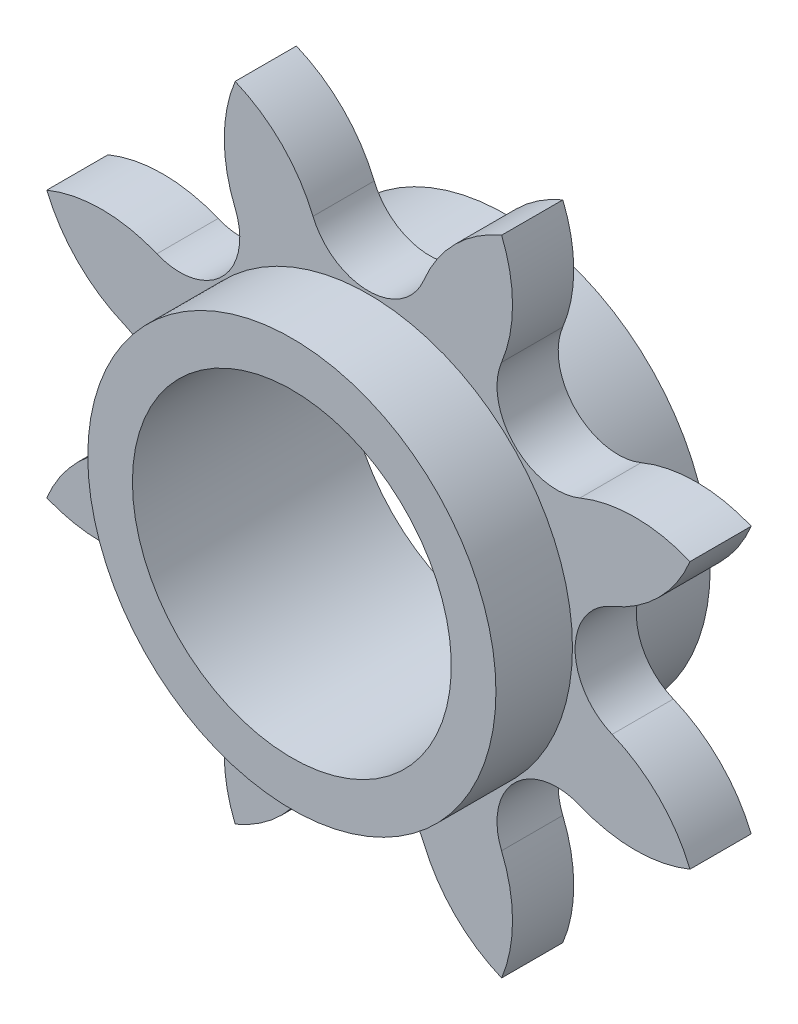
ISO-10303-21;
HEADER;
FILE_DESCRIPTION(('STEP AP214'),'2;1');
FILE_NAME('part.step','',(''),(''),'','','');
FILE_SCHEMA(('AUTOMOTIVE_DESIGN { 1 0 10303 214 1 1 1 1 }'));
ENDSEC;
DATA;
#1=APPLICATION_CONTEXT('core data for automotive mechanical design processes');
#2=APPLICATION_PROTOCOL_DEFINITION('international standard','automotive_design',2000,#1);
#3=PRODUCT_CONTEXT('',#1,'mechanical');
#4=PRODUCT('Part','Part','',(#3));
#5=PRODUCT_RELATED_PRODUCT_CATEGORY('part','',(#4));
#6=PRODUCT_DEFINITION_FORMATION('','',#4);
#7=PRODUCT_DEFINITION_CONTEXT('part definition',#1,'design');
#8=PRODUCT_DEFINITION('design','',#6,#7);
#9=PRODUCT_DEFINITION_SHAPE('','',#8);
#10=(LENGTH_UNIT() NAMED_UNIT(*) SI_UNIT(.MILLI.,.METRE.));
#11=(NAMED_UNIT(*) PLANE_ANGLE_UNIT() SI_UNIT($,.RADIAN.));
#12=(NAMED_UNIT(*) SI_UNIT($,.STERADIAN.) SOLID_ANGLE_UNIT());
#13=UNCERTAINTY_MEASURE_WITH_UNIT(LENGTH_MEASURE(1.E-05),#10,'distance_accuracy_value','');
#14=(GEOMETRIC_REPRESENTATION_CONTEXT(3) GLOBAL_UNCERTAINTY_ASSIGNED_CONTEXT((#13)) GLOBAL_UNIT_ASSIGNED_CONTEXT((#10,
#11,#12)) REPRESENTATION_CONTEXT('',''));
#15=CARTESIAN_POINT('',(0.,0.,0.));
#16=DIRECTION('',(0.,0.,1.));
#17=DIRECTION('',(1.,0.,0.));
#18=AXIS2_PLACEMENT_3D('',#15,#16,#17);
#19=CARTESIAN_POINT('',(8.9217637900216,3.69549432159127,2.4));
#20=DIRECTION('',(0.,0.,1.));
#21=DIRECTION('',(1.,0.,0.));
#22=AXIS2_PLACEMENT_3D('',#19,#20,#21);
#23=PLANE('',#22);
#24=CARTESIAN_POINT('',(0.,0.,2.399999772));
#25=DIRECTION('',(0.,0.,-1.));
#26=DIRECTION('',(-1.,0.,0.));
#27=AXIS2_PLACEMENT_3D('',#24,#25,#26);
#28=CIRCLE('',#27,8.);
#29=CARTESIAN_POINT('',(-8.,0.,2.399999772));
#30=VERTEX_POINT('',#29);
#31=EDGE_CURVE('E749',#30,#30,#28,.T.);
#32=ORIENTED_EDGE('',*,*,#31,.T.);
#33=EDGE_LOOP('',(#32));
#34=FACE_BOUND('',#33,.T.);
#35=CARTESIAN_POINT('',(7.39100003374093,7.39100003364535,2.4));
#36=DIRECTION('',(0.,0.,-1.));
#37=DIRECTION('',(1.,0.,0.));
#38=AXIS2_PLACEMENT_3D('',#35,#36,#37);
#39=CIRCLE('',#38,2.35);
#40=CARTESIAN_POINT('',(8.29030689764834,5.21988346272406,2.4));
#41=VERTEX_POINT('',#40);
#42=CARTESIAN_POINT('',(5.21988346281964,8.29030689755275,2.4));
#43=VERTEX_POINT('',#42);
#44=EDGE_CURVE('E279',#41,#43,#39,.T.);
#45=ORIENTED_EDGE('',*,*,#44,.T.);
#46=CARTESIAN_POINT('',(-3.62645267870014E-05,10.452467400397,2.4));
#47=DIRECTION('',(0.,0.,1.));
#48=DIRECTION('',(1.,0.,0.));
#49=AXIS2_PLACEMENT_3D('',#46,#47,#48);
#50=CIRCLE('',#49,5.65);
#51=CARTESIAN_POINT('',(5.22250382219537,12.6082909188187,2.4));
#52=VERTEX_POINT('',#51);
#53=EDGE_CURVE('E148',#43,#52,#50,.T.);
#54=ORIENTED_EDGE('',*,*,#53,.T.);
#55=CARTESIAN_POINT('',(7.39102751664642,7.39101145662725,2.4));
#56=DIRECTION('',(0.,0.,1.));
#57=DIRECTION('',(1.,0.,0.));
#58=AXIS2_PLACEMENT_3D('',#55,#56,#57);
#59=CIRCLE('',#58,5.65);
#60=CARTESIAN_POINT('',(2.17111657085857,9.55319315991775,2.4));
#61=VERTEX_POINT('',#60);
#62=EDGE_CURVE('E359',#52,#61,#59,.T.);
#63=ORIENTED_EDGE('',*,*,#62,.T.);
#64=CARTESIAN_POINT('',(1.14023537898278E-05,10.4525275175544,2.4));
#65=DIRECTION('',(0.,0.,-1.));
#66=DIRECTION('',(1.,0.,0.));
#67=AXIS2_PLACEMENT_3D('',#64,#65,#66);
#68=CIRCLE('',#67,2.34999998713487);
#69=CARTESIAN_POINT('',(-2.17109709755032,9.55320120237283,2.4));
#70=VERTEX_POINT('',#69);
#71=EDGE_CURVE('E356',#61,#70,#68,.T.);
#72=ORIENTED_EDGE('',*,*,#71,.T.);
#73=CARTESIAN_POINT('',(-7.39100525950942,7.39101277841141,2.4));
#74=DIRECTION('',(0.,0.,1.));
#75=DIRECTION('',(1.,0.,0.));
#76=AXIS2_PLACEMENT_3D('',#73,#74,#75);
#77=CIRCLE('',#76,5.65);
#78=CARTESIAN_POINT('',(-5.22254251672652,12.6083175742962,2.4));
#79=VERTEX_POINT('',#78);
#80=EDGE_CURVE('E358',#70,#79,#77,.T.);
#81=ORIENTED_EDGE('',*,*,#80,.T.);
#82=CARTESIAN_POINT('',(1.14023537898278E-05,10.4525275175544,2.4));
#83=DIRECTION('',(0.,0.,1.));
#84=DIRECTION('',(1.,0.,0.));
#85=AXIS2_PLACEMENT_3D('',#82,#83,#84);
#86=CIRCLE('',#85,5.65000001826973);
#87=CARTESIAN_POINT('',(-5.2198834340444,8.29030687585487,2.4));
#88=VERTEX_POINT('',#87);
#89=EDGE_CURVE('E361',#79,#88,#86,.T.);
#90=ORIENTED_EDGE('',*,*,#89,.T.);
#91=CARTESIAN_POINT('',(-7.39101138319707,7.39102751574179,2.4));
#92=DIRECTION('',(0.,0.,-1.));
#93=DIRECTION('',(1.,0.,0.));
#94=AXIS2_PLACEMENT_3D('',#91,#92,#93);
#95=CIRCLE('',#94,2.34999998704623);
#96=CARTESIAN_POINT('',(-8.2902987856972,5.21990289775648,2.4));
#97=VERTEX_POINT('',#96);
#98=EDGE_CURVE('E367',#88,#97,#95,.T.);
#99=ORIENTED_EDGE('',*,*,#98,.T.);
#100=CARTESIAN_POINT('',(-10.4524397965896,-2.49033742264967E-05,2.4));
#101=DIRECTION('',(0.,0.,1.));
#102=DIRECTION('',(1.,0.,0.));
#103=AXIS2_PLACEMENT_3D('',#100,#101,#102);
#104=CIRCLE('',#103,5.65);
#105=CARTESIAN_POINT('',(-12.6082908612753,5.22250381238154,2.4));
#106=VERTEX_POINT('',#105);
#107=EDGE_CURVE('E369',#97,#106,#104,.T.);
#108=ORIENTED_EDGE('',*,*,#107,.T.);
#109=CARTESIAN_POINT('',(-7.39101138319707,7.39102751574179,2.4));
#110=DIRECTION('',(0.,0.,1.));
#111=DIRECTION('',(1.,0.,0.));
#112=AXIS2_PLACEMENT_3D('',#109,#110,#111);
#113=CIRCLE('',#112,5.65000001808949);
#114=CARTESIAN_POINT('',(-9.55319313609252,2.17111657092126,2.4));
#115=VERTEX_POINT('',#114);
#116=EDGE_CURVE('E371',#106,#115,#113,.T.);
#117=ORIENTED_EDGE('',*,*,#116,.T.);
#118=CARTESIAN_POINT('',(-10.4525274986527,1.13905307449056E-05,2.4));
#119=DIRECTION('',(0.,0.,-1.));
#120=DIRECTION('',(1.,0.,0.));
#121=AXIS2_PLACEMENT_3D('',#118,#119,#120);
#122=CIRCLE('',#121,2.35);
#123=CARTESIAN_POINT('',(-9.55320119040504,-2.17109712617073,2.4));
#124=VERTEX_POINT('',#123);
#125=EDGE_CURVE('E373',#115,#124,#122,.T.);
#126=ORIENTED_EDGE('',*,*,#125,.T.);
#127=CARTESIAN_POINT('',(-7.39101276650105,-7.39100528815362,2.4));
#128=DIRECTION('',(0.,0.,1.));
#129=DIRECTION('',(1.,0.,0.));
#130=AXIS2_PLACEMENT_3D('',#127,#128,#129);
#131=CIRCLE('',#130,5.65);
#132=CARTESIAN_POINT('',(-12.6083175553945,-5.22254252854956,2.4));
#133=VERTEX_POINT('',#132);
#134=EDGE_CURVE('E375',#124,#133,#131,.T.);
#135=ORIENTED_EDGE('',*,*,#134,.T.);
#136=CARTESIAN_POINT('',(-10.4525274986527,1.13905307449056E-05,2.4));
#137=DIRECTION('',(0.,0.,1.));
#138=DIRECTION('',(1.,0.,0.));
#139=AXIS2_PLACEMENT_3D('',#136,#137,#138);
#140=CIRCLE('',#139,5.65000001826973);
#141=CARTESIAN_POINT('',(-8.29030685695307,-5.21988344586741,2.4));
#142=VERTEX_POINT('',#141);
#143=EDGE_CURVE('E377',#133,#142,#140,.T.);
#144=ORIENTED_EDGE('',*,*,#143,.T.);
#145=CARTESIAN_POINT('',(-7.39102749188302,-7.39101140698789,2.4));
#146=DIRECTION('',(0.,0.,-1.));
#147=DIRECTION('',(1.,0.,0.));
#148=AXIS2_PLACEMENT_3D('',#145,#146,#147);
#149=CIRCLE('',#148,2.35);
#150=CARTESIAN_POINT('',(-5.21990286687494,-8.29029882638367,2.4));
#151=VERTEX_POINT('',#150);
#152=EDGE_CURVE('E379',#142,#151,#149,.T.);
#153=ORIENTED_EDGE('',*,*,#152,.T.);
#154=CARTESIAN_POINT('',(2.49342315909035E-05,-10.4524398373344,2.4));
#155=DIRECTION('',(0.,0.,1.));
#156=DIRECTION('',(1.,0.,0.));
#157=AXIS2_PLACEMENT_3D('',#154,#155,#156);
#158=CIRCLE('',#157,5.65);
#159=CARTESIAN_POINT('',(-5.22250378852277,-12.6082908850661,2.4));
#160=VERTEX_POINT('',#159);
#161=EDGE_CURVE('E381',#151,#160,#158,.T.);
#162=ORIENTED_EDGE('',*,*,#161,.T.);
#163=CARTESIAN_POINT('',(-7.39102749188302,-7.39101140698789,2.4));
#164=DIRECTION('',(0.,0.,1.));
#165=DIRECTION('',(1.,0.,0.));
#166=AXIS2_PLACEMENT_3D('',#163,#164,#165);
#167=CIRCLE('',#166,5.65000001808949);
#168=CARTESIAN_POINT('',(-2.17111654706252,-9.55319315988343,2.4));
#169=VERTEX_POINT('',#168);
#170=EDGE_CURVE('E383',#160,#169,#167,.T.);
#171=ORIENTED_EDGE('',*,*,#170,.T.);
#172=CARTESIAN_POINT('',(-1.13666719742071E-05,-10.4525275224435,2.4));
#173=DIRECTION('',(0.,0.,-1.));
#174=DIRECTION('',(1.,0.,0.));
#175=AXIS2_PLACEMENT_3D('',#172,#173,#174);
#176=CIRCLE('',#175,2.35);
#177=CARTESIAN_POINT('',(2.1710971500295,-9.55320121419586,2.4));
#178=VERTEX_POINT('',#177);
#179=EDGE_CURVE('E385',#169,#178,#176,.T.);
#180=ORIENTED_EDGE('',*,*,#179,.T.);
#181=CARTESIAN_POINT('',(7.39100531201239,-7.39101279029188,2.4));
#182=DIRECTION('',(0.,0.,1.));
#183=DIRECTION('',(1.,0.,0.));
#184=AXIS2_PLACEMENT_3D('',#181,#182,#183);
#185=CIRCLE('',#184,5.65);
#186=CARTESIAN_POINT('',(5.22254255240833,-12.6083175791853,2.4));
#187=VERTEX_POINT('',#186);
#188=EDGE_CURVE('E387',#178,#187,#185,.T.);
#189=ORIENTED_EDGE('',*,*,#188,.T.);
#190=CARTESIAN_POINT('',(-1.13666719742071E-05,-10.4525275224435,2.4));
#191=DIRECTION('',(0.,0.,1.));
#192=DIRECTION('',(1.,0.,0.));
#193=AXIS2_PLACEMENT_3D('',#190,#191,#192);
#194=CIRCLE('',#193,5.65000001826973);
#195=CARTESIAN_POINT('',(5.21988346972618,-8.29030688074389,2.4));
#196=VERTEX_POINT('',#195);
#197=EDGE_CURVE('E389',#187,#196,#194,.T.);
#198=ORIENTED_EDGE('',*,*,#197,.T.);
#199=CARTESIAN_POINT('',(7.39101143084667,-7.39102751567385,2.4));
#200=DIRECTION('',(0.,0.,-1.));
#201=DIRECTION('',(1.,0.,0.));
#202=AXIS2_PLACEMENT_3D('',#199,#200,#201);
#203=CIRCLE('',#202,2.35);
#204=CARTESIAN_POINT('',(8.29029885024244,-5.21990289066577,2.4));
#205=VERTEX_POINT('',#204);
#206=EDGE_CURVE('E391',#196,#205,#203,.T.);
#207=ORIENTED_EDGE('',*,*,#206,.T.);
#208=CARTESIAN_POINT('',(10.4524398611928,2.4910440924418E-05,2.4));
#209=DIRECTION('',(0.,0.,1.));
#210=DIRECTION('',(1.,0.,0.));
#211=AXIS2_PLACEMENT_3D('',#208,#209,#210);
#212=CIRCLE('',#211,5.65);
#213=CARTESIAN_POINT('',(12.6082909089248,-5.22250381231332,2.4));
#214=VERTEX_POINT('',#213);
#215=EDGE_CURVE('E393',#205,#214,#212,.T.);
#216=ORIENTED_EDGE('',*,*,#215,.T.);
#217=CARTESIAN_POINT('',(7.39101143084667,-7.39102751567385,2.4));
#218=DIRECTION('',(0.,0.,1.));
#219=DIRECTION('',(1.,0.,0.));
#220=AXIS2_PLACEMENT_3D('',#217,#218,#219);
#221=CIRCLE('',#220,5.65000001808949);
#222=CARTESIAN_POINT('',(9.5531931837422,-2.17111657085335,2.4));
#223=VERTEX_POINT('',#222);
#224=EDGE_CURVE('E214',#214,#223,#221,.T.);
#225=ORIENTED_EDGE('',*,*,#224,.T.);
#226=CARTESIAN_POINT('',(10.4525275463023,-1.1390462801873E-05,2.4));
#227=DIRECTION('',(0.,0.,-1.));
#228=DIRECTION('',(1.,0.,0.));
#229=AXIS2_PLACEMENT_3D('',#226,#227,#228);
#230=CIRCLE('',#229,2.35);
#231=CARTESIAN_POINT('',(9.55320123805464,2.17109712623868,2.4));
#232=VERTEX_POINT('',#231);
#233=EDGE_CURVE('E209',#223,#232,#230,.T.);
#234=ORIENTED_EDGE('',*,*,#233,.T.);
#235=CARTESIAN_POINT('',(7.39101281409294,7.39100528819766,2.4));
#236=DIRECTION('',(0.,0.,1.));
#237=DIRECTION('',(1.,0.,0.));
#238=AXIS2_PLACEMENT_3D('',#235,#236,#237);
#239=CIRCLE('',#238,5.65);
#240=CARTESIAN_POINT('',(12.6083176099777,5.22254254541476,2.4));
#241=VERTEX_POINT('',#240);
#242=EDGE_CURVE('E212',#232,#241,#239,.T.);
#243=ORIENTED_EDGE('',*,*,#242,.T.);
#244=CARTESIAN_POINT('',(10.4525275463023,-1.1390462801873E-05,2.4));
#245=DIRECTION('',(0.,0.,1.));
#246=DIRECTION('',(1.,0.,0.));
#247=AXIS2_PLACEMENT_3D('',#244,#245,#246);
#248=CIRCLE('',#247,5.65000003644178);
#249=EDGE_CURVE('E56',#241,#41,#248,.T.);
#250=ORIENTED_EDGE('',*,*,#249,.T.);
#251=EDGE_LOOP('',(#45,#54,#63,#72,#81,#90,#99,#108,#117,#126,#135,#144,#153,#162,#171,#180,
#189,#198,#207,#216,#225,#234,#243,#250));
#252=FACE_BOUND('',#251,.T.);
#253=ADVANCED_FACE('F38',(#34,#252),#23,.T.);
#254=CARTESIAN_POINT('',(8.9217637900216,3.69549432159127,0.));
#255=DIRECTION('',(0.,0.,1.));
#256=DIRECTION('',(1.,0.,0.));
#257=AXIS2_PLACEMENT_3D('',#254,#255,#256);
#258=PLANE('',#257);
#259=CARTESIAN_POINT('',(0.,0.,0.));
#260=DIRECTION('',(0.,0.,-1.));
#261=DIRECTION('',(-1.,0.,0.));
#262=AXIS2_PLACEMENT_3D('',#259,#260,#261);
#263=CIRCLE('',#262,8.);
#264=CARTESIAN_POINT('',(-8.,0.,0.));
#265=VERTEX_POINT('',#264);
#266=EDGE_CURVE('E11',#265,#265,#263,.T.);
#267=ORIENTED_EDGE('',*,*,#266,.F.);
#268=EDGE_LOOP('',(#267));
#269=FACE_BOUND('',#268,.T.);
#270=CARTESIAN_POINT('',(7.39100003374093,7.39100003364535,0.));
#271=DIRECTION('',(0.,0.,-1.));
#272=DIRECTION('',(1.,0.,0.));
#273=AXIS2_PLACEMENT_3D('',#270,#271,#272);
#274=CIRCLE('',#273,2.35);
#275=CARTESIAN_POINT('',(8.29030689764834,5.21988346272406,0.));
#276=VERTEX_POINT('',#275);
#277=CARTESIAN_POINT('',(5.21988346281964,8.29030689755275,0.));
#278=VERTEX_POINT('',#277);
#279=EDGE_CURVE('E232',#276,#278,#274,.T.);
#280=ORIENTED_EDGE('',*,*,#279,.F.);
#281=CARTESIAN_POINT('',(10.4525275463023,-1.1390462801873E-05,0.));
#282=DIRECTION('',(0.,0.,1.));
#283=DIRECTION('',(1.,0.,0.));
#284=AXIS2_PLACEMENT_3D('',#281,#282,#283);
#285=CIRCLE('',#284,5.65000003644178);
#286=CARTESIAN_POINT('',(12.6083176099777,5.22254254541476,0.));
#287=VERTEX_POINT('',#286);
#288=EDGE_CURVE('E139',#287,#276,#285,.T.);
#289=ORIENTED_EDGE('',*,*,#288,.F.);
#290=CARTESIAN_POINT('',(7.39101281409294,7.39100528819766,0.));
#291=DIRECTION('',(0.,0.,1.));
#292=DIRECTION('',(1.,0.,0.));
#293=AXIS2_PLACEMENT_3D('',#290,#291,#292);
#294=CIRCLE('',#293,5.65);
#295=CARTESIAN_POINT('',(9.55320123805464,2.17109712623868,0.));
#296=VERTEX_POINT('',#295);
#297=EDGE_CURVE('E133',#296,#287,#294,.T.);
#298=ORIENTED_EDGE('',*,*,#297,.F.);
#299=CARTESIAN_POINT('',(10.4525275463023,-1.1390462801873E-05,0.));
#300=DIRECTION('',(0.,0.,-1.));
#301=DIRECTION('',(1.,0.,0.));
#302=AXIS2_PLACEMENT_3D('',#299,#300,#301);
#303=CIRCLE('',#302,2.35);
#304=CARTESIAN_POINT('',(9.5531931837422,-2.17111657085335,0.));
#305=VERTEX_POINT('',#304);
#306=EDGE_CURVE('E222',#305,#296,#303,.T.);
#307=ORIENTED_EDGE('',*,*,#306,.F.);
#308=CARTESIAN_POINT('',(7.39101143084667,-7.39102751567385,0.));
#309=DIRECTION('',(0.,0.,1.));
#310=DIRECTION('',(1.,0.,0.));
#311=AXIS2_PLACEMENT_3D('',#308,#309,#310);
#312=CIRCLE('',#311,5.65000001808949);
#313=CARTESIAN_POINT('',(12.6082909089248,-5.22250381231332,0.));
#314=VERTEX_POINT('',#313);
#315=EDGE_CURVE('E274',#314,#305,#312,.T.);
#316=ORIENTED_EDGE('',*,*,#315,.F.);
#317=CARTESIAN_POINT('',(10.4524398611928,2.4910440924418E-05,0.));
#318=DIRECTION('',(0.,0.,1.));
#319=DIRECTION('',(1.,0.,0.));
#320=AXIS2_PLACEMENT_3D('',#317,#318,#319);
#321=CIRCLE('',#320,5.65);
#322=CARTESIAN_POINT('',(8.29029885024244,-5.21990289066577,0.));
#323=VERTEX_POINT('',#322);
#324=EDGE_CURVE('E272',#323,#314,#321,.T.);
#325=ORIENTED_EDGE('',*,*,#324,.F.);
#326=CARTESIAN_POINT('',(7.39101143084667,-7.39102751567385,0.));
#327=DIRECTION('',(0.,0.,-1.));
#328=DIRECTION('',(1.,0.,0.));
#329=AXIS2_PLACEMENT_3D('',#326,#327,#328);
#330=CIRCLE('',#329,2.35);
#331=CARTESIAN_POINT('',(5.21988346972618,-8.29030688074389,0.));
#332=VERTEX_POINT('',#331);
#333=EDGE_CURVE('E270',#332,#323,#330,.T.);
#334=ORIENTED_EDGE('',*,*,#333,.F.);
#335=CARTESIAN_POINT('',(-1.13666719742071E-05,-10.4525275224435,0.));
#336=DIRECTION('',(0.,0.,1.));
#337=DIRECTION('',(1.,0.,0.));
#338=AXIS2_PLACEMENT_3D('',#335,#336,#337);
#339=CIRCLE('',#338,5.65000001826973);
#340=CARTESIAN_POINT('',(5.22254255240833,-12.6083175791853,0.));
#341=VERTEX_POINT('',#340);
#342=EDGE_CURVE('E268',#341,#332,#339,.T.);
#343=ORIENTED_EDGE('',*,*,#342,.F.);
#344=CARTESIAN_POINT('',(7.39100531201239,-7.39101279029188,0.));
#345=DIRECTION('',(0.,0.,1.));
#346=DIRECTION('',(1.,0.,0.));
#347=AXIS2_PLACEMENT_3D('',#344,#345,#346);
#348=CIRCLE('',#347,5.65);
#349=CARTESIAN_POINT('',(2.1710971500295,-9.55320121419586,0.));
#350=VERTEX_POINT('',#349);
#351=EDGE_CURVE('E266',#350,#341,#348,.T.);
#352=ORIENTED_EDGE('',*,*,#351,.F.);
#353=CARTESIAN_POINT('',(-1.13666719742071E-05,-10.4525275224435,0.));
#354=DIRECTION('',(0.,0.,-1.));
#355=DIRECTION('',(1.,0.,0.));
#356=AXIS2_PLACEMENT_3D('',#353,#354,#355);
#357=CIRCLE('',#356,2.35);
#358=CARTESIAN_POINT('',(-2.17111654706252,-9.55319315988343,0.));
#359=VERTEX_POINT('',#358);
#360=EDGE_CURVE('E264',#359,#350,#357,.T.);
#361=ORIENTED_EDGE('',*,*,#360,.F.);
#362=CARTESIAN_POINT('',(-7.39102749188302,-7.39101140698789,0.));
#363=DIRECTION('',(0.,0.,1.));
#364=DIRECTION('',(1.,0.,0.));
#365=AXIS2_PLACEMENT_3D('',#362,#363,#364);
#366=CIRCLE('',#365,5.65000001808949);
#367=CARTESIAN_POINT('',(-5.22250378852277,-12.6082908850661,0.));
#368=VERTEX_POINT('',#367);
#369=EDGE_CURVE('E262',#368,#359,#366,.T.);
#370=ORIENTED_EDGE('',*,*,#369,.F.);
#371=CARTESIAN_POINT('',(2.49342315909035E-05,-10.4524398373344,0.));
#372=DIRECTION('',(0.,0.,1.));
#373=DIRECTION('',(1.,0.,0.));
#374=AXIS2_PLACEMENT_3D('',#371,#372,#373);
#375=CIRCLE('',#374,5.65);
#376=CARTESIAN_POINT('',(-5.21990286687494,-8.29029882638367,0.));
#377=VERTEX_POINT('',#376);
#378=EDGE_CURVE('E260',#377,#368,#375,.T.);
#379=ORIENTED_EDGE('',*,*,#378,.F.);
#380=CARTESIAN_POINT('',(-7.39102749188302,-7.39101140698789,0.));
#381=DIRECTION('',(0.,0.,-1.));
#382=DIRECTION('',(1.,0.,0.));
#383=AXIS2_PLACEMENT_3D('',#380,#381,#382);
#384=CIRCLE('',#383,2.35);
#385=CARTESIAN_POINT('',(-8.29030685695307,-5.21988344586741,0.));
#386=VERTEX_POINT('',#385);
#387=EDGE_CURVE('E258',#386,#377,#384,.T.);
#388=ORIENTED_EDGE('',*,*,#387,.F.);
#389=CARTESIAN_POINT('',(-10.4525274986527,1.13905307449056E-05,0.));
#390=DIRECTION('',(0.,0.,1.));
#391=DIRECTION('',(1.,0.,0.));
#392=AXIS2_PLACEMENT_3D('',#389,#390,#391);
#393=CIRCLE('',#392,5.65000001826973);
#394=CARTESIAN_POINT('',(-12.6083175553945,-5.22254252854956,0.));
#395=VERTEX_POINT('',#394);
#396=EDGE_CURVE('E256',#395,#386,#393,.T.);
#397=ORIENTED_EDGE('',*,*,#396,.F.);
#398=CARTESIAN_POINT('',(-7.39101276650105,-7.39100528815362,0.));
#399=DIRECTION('',(0.,0.,1.));
#400=DIRECTION('',(1.,0.,0.));
#401=AXIS2_PLACEMENT_3D('',#398,#399,#400);
#402=CIRCLE('',#401,5.65);
#403=CARTESIAN_POINT('',(-9.55320119040504,-2.17109712617073,0.));
#404=VERTEX_POINT('',#403);
#405=EDGE_CURVE('E254',#404,#395,#402,.T.);
#406=ORIENTED_EDGE('',*,*,#405,.F.);
#407=CARTESIAN_POINT('',(-10.4525274986527,1.13905307449056E-05,0.));
#408=DIRECTION('',(0.,0.,-1.));
#409=DIRECTION('',(1.,0.,0.));
#410=AXIS2_PLACEMENT_3D('',#407,#408,#409);
#411=CIRCLE('',#410,2.35);
#412=CARTESIAN_POINT('',(-9.55319313609252,2.17111657092126,0.));
#413=VERTEX_POINT('',#412);
#414=EDGE_CURVE('E252',#413,#404,#411,.T.);
#415=ORIENTED_EDGE('',*,*,#414,.F.);
#416=CARTESIAN_POINT('',(-7.39101138319707,7.39102751574179,0.));
#417=DIRECTION('',(0.,0.,1.));
#418=DIRECTION('',(1.,0.,0.));
#419=AXIS2_PLACEMENT_3D('',#416,#417,#418);
#420=CIRCLE('',#419,5.65000001808949);
#421=CARTESIAN_POINT('',(-12.6082908612753,5.22250381238154,0.));
#422=VERTEX_POINT('',#421);
#423=EDGE_CURVE('E250',#422,#413,#420,.T.);
#424=ORIENTED_EDGE('',*,*,#423,.F.);
#425=CARTESIAN_POINT('',(-10.4524397965896,-2.49033742264967E-05,0.));
#426=DIRECTION('',(0.,0.,1.));
#427=DIRECTION('',(1.,0.,0.));
#428=AXIS2_PLACEMENT_3D('',#425,#426,#427);
#429=CIRCLE('',#428,5.65);
#430=CARTESIAN_POINT('',(-8.2902987856972,5.21990289775648,0.));
#431=VERTEX_POINT('',#430);
#432=EDGE_CURVE('E248',#431,#422,#429,.T.);
#433=ORIENTED_EDGE('',*,*,#432,.F.);
#434=CARTESIAN_POINT('',(-7.39101138319707,7.39102751574179,0.));
#435=DIRECTION('',(0.,0.,-1.));
#436=DIRECTION('',(1.,0.,0.));
#437=AXIS2_PLACEMENT_3D('',#434,#435,#436);
#438=CIRCLE('',#437,2.34999998704623);
#439=CARTESIAN_POINT('',(-5.2198834340444,8.29030687585487,0.));
#440=VERTEX_POINT('',#439);
#441=EDGE_CURVE('E246',#440,#431,#438,.T.);
#442=ORIENTED_EDGE('',*,*,#441,.F.);
#443=CARTESIAN_POINT('',(1.14023537898278E-05,10.4525275175544,0.));
#444=DIRECTION('',(0.,0.,1.));
#445=DIRECTION('',(1.,0.,0.));
#446=AXIS2_PLACEMENT_3D('',#443,#444,#445);
#447=CIRCLE('',#446,5.65000001826973);
#448=CARTESIAN_POINT('',(-5.22254251672652,12.6083175742962,0.));
#449=VERTEX_POINT('',#448);
#450=EDGE_CURVE('E244',#449,#440,#447,.T.);
#451=ORIENTED_EDGE('',*,*,#450,.F.);
#452=CARTESIAN_POINT('',(-7.39100525950942,7.39101277841141,0.));
#453=DIRECTION('',(0.,0.,1.));
#454=DIRECTION('',(1.,0.,0.));
#455=AXIS2_PLACEMENT_3D('',#452,#453,#454);
#456=CIRCLE('',#455,5.65);
#457=CARTESIAN_POINT('',(-2.17109709755032,9.55320120237283,0.));
#458=VERTEX_POINT('',#457);
#459=EDGE_CURVE('E242',#458,#449,#456,.T.);
#460=ORIENTED_EDGE('',*,*,#459,.F.);
#461=CARTESIAN_POINT('',(1.14023537898278E-05,10.4525275175544,0.));
#462=DIRECTION('',(0.,0.,-1.));
#463=DIRECTION('',(1.,0.,0.));
#464=AXIS2_PLACEMENT_3D('',#461,#462,#463);
#465=CIRCLE('',#464,2.34999998713487);
#466=CARTESIAN_POINT('',(2.17111657085857,9.55319315991775,0.));
#467=VERTEX_POINT('',#466);
#468=EDGE_CURVE('E240',#467,#458,#465,.T.);
#469=ORIENTED_EDGE('',*,*,#468,.F.);
#470=CARTESIAN_POINT('',(7.39102751664642,7.39101145662725,0.));
#471=DIRECTION('',(0.,0.,1.));
#472=DIRECTION('',(1.,0.,0.));
#473=AXIS2_PLACEMENT_3D('',#470,#471,#472);
#474=CIRCLE('',#473,5.65);
#475=CARTESIAN_POINT('',(5.22250382219537,12.6082909188187,0.));
#476=VERTEX_POINT('',#475);
#477=EDGE_CURVE('E238',#476,#467,#474,.T.);
#478=ORIENTED_EDGE('',*,*,#477,.F.);
#479=CARTESIAN_POINT('',(-3.62645267870014E-05,10.452467400397,0.));
#480=DIRECTION('',(0.,0.,1.));
#481=DIRECTION('',(1.,0.,0.));
#482=AXIS2_PLACEMENT_3D('',#479,#480,#481);
#483=CIRCLE('',#482,5.65);
#484=EDGE_CURVE('E235',#278,#476,#483,.T.);
#485=ORIENTED_EDGE('',*,*,#484,.F.);
#486=EDGE_LOOP('',(#280,#289,#298,#307,#316,#325,#334,#343,#352,#361,#370,#379,#388,#397,#406,
#415,#424,#433,#442,#451,#460,#469,#478,#485));
#487=FACE_BOUND('',#486,.T.);
#488=ADVANCED_FACE('F347',(#269,#487),#258,.F.);
#489=CARTESIAN_POINT('',(7.39100003374093,7.39100003364535,2.4));
#490=DIRECTION('',(0.,0.,-1.));
#491=DIRECTION('',(-1.,0.,0.));
#492=AXIS2_PLACEMENT_3D('',#489,#490,#491);
#493=CYLINDRICAL_SURFACE('',#492,2.35);
#494=ORIENTED_EDGE('',*,*,#279,.T.);
#495=DIRECTION('',(0.,0.,-1.));
#496=VECTOR('',#495,1.);
#497=CARTESIAN_POINT('',(5.21988346281964,8.29030689755275,2.4));
#498=LINE('',#497,#496);
#499=EDGE_CURVE('E42',#43,#278,#498,.T.);
#500=ORIENTED_EDGE('',*,*,#499,.F.);
#501=ORIENTED_EDGE('',*,*,#44,.F.);
#502=DIRECTION('',(0.,0.,-1.));
#503=VECTOR('',#502,1.);
#504=CARTESIAN_POINT('',(8.29030689764834,5.21988346272406,2.4));
#505=LINE('',#504,#503);
#506=EDGE_CURVE('E228',#41,#276,#505,.T.);
#507=ORIENTED_EDGE('',*,*,#506,.T.);
#508=EDGE_LOOP('',(#494,#500,#501,#507));
#509=FACE_BOUND('',#508,.T.);
#510=ADVANCED_FACE('F40',(#509),#493,.F.);
#511=CARTESIAN_POINT('',(-3.62645267870014E-05,10.452467400397,2.4));
#512=DIRECTION('',(0.,0.,-1.));
#513=DIRECTION('',(-1.,0.,0.));
#514=AXIS2_PLACEMENT_3D('',#511,#512,#513);
#515=CYLINDRICAL_SURFACE('',#514,5.65);
#516=ORIENTED_EDGE('',*,*,#484,.T.);
#517=DIRECTION('',(0.,0.,-1.));
#518=VECTOR('',#517,1.);
#519=CARTESIAN_POINT('',(5.22250382219537,12.6082909188187,2.4));
#520=LINE('',#519,#518);
#521=EDGE_CURVE('E336',#52,#476,#520,.T.);
#522=ORIENTED_EDGE('',*,*,#521,.F.);
#523=ORIENTED_EDGE('',*,*,#53,.F.);
#524=ORIENTED_EDGE('',*,*,#499,.T.);
#525=EDGE_LOOP('',(#516,#522,#523,#524));
#526=FACE_BOUND('',#525,.T.);
#527=ADVANCED_FACE('F342',(#526),#515,.T.);
#528=CARTESIAN_POINT('',(7.39102751664642,7.39101145662725,2.4));
#529=DIRECTION('',(0.,0.,-1.));
#530=DIRECTION('',(-1.,0.,0.));
#531=AXIS2_PLACEMENT_3D('',#528,#529,#530);
#532=CYLINDRICAL_SURFACE('',#531,5.65);
#533=ORIENTED_EDGE('',*,*,#477,.T.);
#534=DIRECTION('',(0.,0.,-1.));
#535=VECTOR('',#534,1.);
#536=CARTESIAN_POINT('',(2.17111657085857,9.55319315991775,2.4));
#537=LINE('',#536,#535);
#538=EDGE_CURVE('E334',#61,#467,#537,.T.);
#539=ORIENTED_EDGE('',*,*,#538,.F.);
#540=ORIENTED_EDGE('',*,*,#62,.F.);
#541=ORIENTED_EDGE('',*,*,#521,.T.);
#542=EDGE_LOOP('',(#533,#539,#540,#541));
#543=FACE_BOUND('',#542,.T.);
#544=ADVANCED_FACE('F351',(#543),#532,.T.);
#545=CARTESIAN_POINT('',(1.14023537898278E-05,10.4525275175544,2.4));
#546=DIRECTION('',(0.,0.,-1.));
#547=DIRECTION('',(-1.,0.,0.));
#548=AXIS2_PLACEMENT_3D('',#545,#546,#547);
#549=CYLINDRICAL_SURFACE('',#548,2.34999998713487);
#550=ORIENTED_EDGE('',*,*,#468,.T.);
#551=DIRECTION('',(0.,0.,-1.));
#552=VECTOR('',#551,1.);
#553=CARTESIAN_POINT('',(-2.17109709755032,9.55320120237283,2.4));
#554=LINE('',#553,#552);
#555=EDGE_CURVE('E331',#70,#458,#554,.T.);
#556=ORIENTED_EDGE('',*,*,#555,.F.);
#557=ORIENTED_EDGE('',*,*,#71,.F.);
#558=ORIENTED_EDGE('',*,*,#538,.T.);
#559=EDGE_LOOP('',(#550,#556,#557,#558));
#560=FACE_BOUND('',#559,.T.);
#561=ADVANCED_FACE('F354',(#560),#549,.F.);
#562=CARTESIAN_POINT('',(-7.39100525950942,7.39101277841141,2.4));
#563=DIRECTION('',(0.,0.,-1.));
#564=DIRECTION('',(-1.,0.,0.));
#565=AXIS2_PLACEMENT_3D('',#562,#563,#564);
#566=CYLINDRICAL_SURFACE('',#565,5.65);
#567=ORIENTED_EDGE('',*,*,#459,.T.);
#568=DIRECTION('',(0.,0.,-1.));
#569=VECTOR('',#568,1.);
#570=CARTESIAN_POINT('',(-5.22254251672652,12.6083175742962,2.4));
#571=LINE('',#570,#569);
#572=EDGE_CURVE('E328',#79,#449,#571,.T.);
#573=ORIENTED_EDGE('',*,*,#572,.F.);
#574=ORIENTED_EDGE('',*,*,#80,.F.);
#575=ORIENTED_EDGE('',*,*,#555,.T.);
#576=EDGE_LOOP('',(#567,#573,#574,#575));
#577=FACE_BOUND('',#576,.T.);
#578=ADVANCED_FACE('F474',(#577),#566,.T.);
#579=CARTESIAN_POINT('',(1.14023537898278E-05,10.4525275175544,2.4));
#580=DIRECTION('',(0.,0.,-1.));
#581=DIRECTION('',(-1.,0.,0.));
#582=AXIS2_PLACEMENT_3D('',#579,#580,#581);
#583=CYLINDRICAL_SURFACE('',#582,5.65000001826973);
#584=ORIENTED_EDGE('',*,*,#450,.T.);
#585=DIRECTION('',(0.,0.,-1.));
#586=VECTOR('',#585,1.);
#587=CARTESIAN_POINT('',(-5.2198834340444,8.29030687585487,2.4));
#588=LINE('',#587,#586);
#589=EDGE_CURVE('E325',#88,#440,#588,.T.);
#590=ORIENTED_EDGE('',*,*,#589,.F.);
#591=ORIENTED_EDGE('',*,*,#89,.F.);
#592=ORIENTED_EDGE('',*,*,#572,.T.);
#593=EDGE_LOOP('',(#584,#590,#591,#592));
#594=FACE_BOUND('',#593,.T.);
#595=ADVANCED_FACE('F471',(#594),#583,.T.);
#596=CARTESIAN_POINT('',(-7.39101138319707,7.39102751574179,2.4));
#597=DIRECTION('',(0.,0.,-1.));
#598=DIRECTION('',(-1.,0.,0.));
#599=AXIS2_PLACEMENT_3D('',#596,#597,#598);
#600=CYLINDRICAL_SURFACE('',#599,2.34999998704623);
#601=ORIENTED_EDGE('',*,*,#441,.T.);
#602=DIRECTION('',(0.,0.,-1.));
#603=VECTOR('',#602,1.);
#604=CARTESIAN_POINT('',(-8.2902987856972,5.21990289775648,2.4));
#605=LINE('',#604,#603);
#606=EDGE_CURVE('E322',#97,#431,#605,.T.);
#607=ORIENTED_EDGE('',*,*,#606,.F.);
#608=ORIENTED_EDGE('',*,*,#98,.F.);
#609=ORIENTED_EDGE('',*,*,#589,.T.);
#610=EDGE_LOOP('',(#601,#607,#608,#609));
#611=FACE_BOUND('',#610,.T.);
#612=ADVANCED_FACE('F466',(#611),#600,.F.);
#613=CARTESIAN_POINT('',(-10.4524397965896,-2.49033742264967E-05,2.4));
#614=DIRECTION('',(0.,0.,-1.));
#615=DIRECTION('',(-1.,0.,0.));
#616=AXIS2_PLACEMENT_3D('',#613,#614,#615);
#617=CYLINDRICAL_SURFACE('',#616,5.65);
#618=ORIENTED_EDGE('',*,*,#432,.T.);
#619=DIRECTION('',(0.,0.,-1.));
#620=VECTOR('',#619,1.);
#621=CARTESIAN_POINT('',(-12.6082908612753,5.22250381238154,2.4));
#622=LINE('',#621,#620);
#623=EDGE_CURVE('E319',#106,#422,#622,.T.);
#624=ORIENTED_EDGE('',*,*,#623,.F.);
#625=ORIENTED_EDGE('',*,*,#107,.F.);
#626=ORIENTED_EDGE('',*,*,#606,.T.);
#627=EDGE_LOOP('',(#618,#624,#625,#626));
#628=FACE_BOUND('',#627,.T.);
#629=ADVANCED_FACE('F461',(#628),#617,.T.);
#630=CARTESIAN_POINT('',(-7.39101138319707,7.39102751574179,2.4));
#631=DIRECTION('',(0.,0.,-1.));
#632=DIRECTION('',(-1.,0.,0.));
#633=AXIS2_PLACEMENT_3D('',#630,#631,#632);
#634=CYLINDRICAL_SURFACE('',#633,5.65000001808949);
#635=ORIENTED_EDGE('',*,*,#423,.T.);
#636=DIRECTION('',(0.,0.,-1.));
#637=VECTOR('',#636,1.);
#638=CARTESIAN_POINT('',(-9.55319313609252,2.17111657092126,2.4));
#639=LINE('',#638,#637);
#640=EDGE_CURVE('E316',#115,#413,#639,.T.);
#641=ORIENTED_EDGE('',*,*,#640,.F.);
#642=ORIENTED_EDGE('',*,*,#116,.F.);
#643=ORIENTED_EDGE('',*,*,#623,.T.);
#644=EDGE_LOOP('',(#635,#641,#642,#643));
#645=FACE_BOUND('',#644,.T.);
#646=ADVANCED_FACE('F457',(#645),#634,.T.);
#647=CARTESIAN_POINT('',(-10.4525274986527,1.13905307449056E-05,2.4));
#648=DIRECTION('',(0.,0.,-1.));
#649=DIRECTION('',(-1.,0.,0.));
#650=AXIS2_PLACEMENT_3D('',#647,#648,#649);
#651=CYLINDRICAL_SURFACE('',#650,2.35);
#652=ORIENTED_EDGE('',*,*,#414,.T.);
#653=DIRECTION('',(0.,0.,-1.));
#654=VECTOR('',#653,1.);
#655=CARTESIAN_POINT('',(-9.55320119040504,-2.17109712617073,2.4));
#656=LINE('',#655,#654);
#657=EDGE_CURVE('E313',#124,#404,#656,.T.);
#658=ORIENTED_EDGE('',*,*,#657,.F.);
#659=ORIENTED_EDGE('',*,*,#125,.F.);
#660=ORIENTED_EDGE('',*,*,#640,.T.);
#661=EDGE_LOOP('',(#652,#658,#659,#660));
#662=FACE_BOUND('',#661,.T.);
#663=ADVANCED_FACE('F452',(#662),#651,.F.);
#664=CARTESIAN_POINT('',(-7.39101276650105,-7.39100528815362,2.4));
#665=DIRECTION('',(0.,0.,-1.));
#666=DIRECTION('',(-1.,0.,0.));
#667=AXIS2_PLACEMENT_3D('',#664,#665,#666);
#668=CYLINDRICAL_SURFACE('',#667,5.65);
#669=ORIENTED_EDGE('',*,*,#405,.T.);
#670=DIRECTION('',(0.,0.,-1.));
#671=VECTOR('',#670,1.);
#672=CARTESIAN_POINT('',(-12.6083175553945,-5.22254252854956,2.4));
#673=LINE('',#672,#671);
#674=EDGE_CURVE('E310',#133,#395,#673,.T.);
#675=ORIENTED_EDGE('',*,*,#674,.F.);
#676=ORIENTED_EDGE('',*,*,#134,.F.);
#677=ORIENTED_EDGE('',*,*,#657,.T.);
#678=EDGE_LOOP('',(#669,#675,#676,#677));
#679=FACE_BOUND('',#678,.T.);
#680=ADVANCED_FACE('F446',(#679),#668,.T.);
#681=CARTESIAN_POINT('',(-10.4525274986527,1.13905307449056E-05,2.4));
#682=DIRECTION('',(0.,0.,-1.));
#683=DIRECTION('',(-1.,0.,0.));
#684=AXIS2_PLACEMENT_3D('',#681,#682,#683);
#685=CYLINDRICAL_SURFACE('',#684,5.65000001826973);
#686=ORIENTED_EDGE('',*,*,#396,.T.);
#687=DIRECTION('',(0.,0.,-1.));
#688=VECTOR('',#687,1.);
#689=CARTESIAN_POINT('',(-8.29030685695307,-5.21988344586741,2.4));
#690=LINE('',#689,#688);
#691=EDGE_CURVE('E307',#142,#386,#690,.T.);
#692=ORIENTED_EDGE('',*,*,#691,.F.);
#693=ORIENTED_EDGE('',*,*,#143,.F.);
#694=ORIENTED_EDGE('',*,*,#674,.T.);
#695=EDGE_LOOP('',(#686,#692,#693,#694));
#696=FACE_BOUND('',#695,.T.);
#697=ADVANCED_FACE('F442',(#696),#685,.T.);
#698=CARTESIAN_POINT('',(-7.39102749188302,-7.39101140698789,2.4));
#699=DIRECTION('',(0.,0.,-1.));
#700=DIRECTION('',(-1.,0.,0.));
#701=AXIS2_PLACEMENT_3D('',#698,#699,#700);
#702=CYLINDRICAL_SURFACE('',#701,2.35);
#703=ORIENTED_EDGE('',*,*,#387,.T.);
#704=DIRECTION('',(0.,0.,-1.));
#705=VECTOR('',#704,1.);
#706=CARTESIAN_POINT('',(-5.21990286687494,-8.29029882638367,2.4));
#707=LINE('',#706,#705);
#708=EDGE_CURVE('E304',#151,#377,#707,.T.);
#709=ORIENTED_EDGE('',*,*,#708,.F.);
#710=ORIENTED_EDGE('',*,*,#152,.F.);
#711=ORIENTED_EDGE('',*,*,#691,.T.);
#712=EDGE_LOOP('',(#703,#709,#710,#711));
#713=FACE_BOUND('',#712,.T.);
#714=ADVANCED_FACE('F437',(#713),#702,.F.);
#715=CARTESIAN_POINT('',(2.49342315909035E-05,-10.4524398373344,2.4));
#716=DIRECTION('',(0.,0.,-1.));
#717=DIRECTION('',(-1.,0.,0.));
#718=AXIS2_PLACEMENT_3D('',#715,#716,#717);
#719=CYLINDRICAL_SURFACE('',#718,5.65);
#720=ORIENTED_EDGE('',*,*,#378,.T.);
#721=DIRECTION('',(0.,0.,-1.));
#722=VECTOR('',#721,1.);
#723=CARTESIAN_POINT('',(-5.22250378852277,-12.6082908850661,2.4));
#724=LINE('',#723,#722);
#725=EDGE_CURVE('E301',#160,#368,#724,.T.);
#726=ORIENTED_EDGE('',*,*,#725,.F.);
#727=ORIENTED_EDGE('',*,*,#161,.F.);
#728=ORIENTED_EDGE('',*,*,#708,.T.);
#729=EDGE_LOOP('',(#720,#726,#727,#728));
#730=FACE_BOUND('',#729,.T.);
#731=ADVANCED_FACE('F431',(#730),#719,.T.);
#732=CARTESIAN_POINT('',(-7.39102749188302,-7.39101140698789,2.4));
#733=DIRECTION('',(0.,0.,-1.));
#734=DIRECTION('',(-1.,0.,0.));
#735=AXIS2_PLACEMENT_3D('',#732,#733,#734);
#736=CYLINDRICAL_SURFACE('',#735,5.65000001808949);
#737=ORIENTED_EDGE('',*,*,#369,.T.);
#738=DIRECTION('',(0.,0.,-1.));
#739=VECTOR('',#738,1.);
#740=CARTESIAN_POINT('',(-2.17111654706252,-9.55319315988343,2.4));
#741=LINE('',#740,#739);
#742=EDGE_CURVE('E298',#169,#359,#741,.T.);
#743=ORIENTED_EDGE('',*,*,#742,.F.);
#744=ORIENTED_EDGE('',*,*,#170,.F.);
#745=ORIENTED_EDGE('',*,*,#725,.T.);
#746=EDGE_LOOP('',(#737,#743,#744,#745));
#747=FACE_BOUND('',#746,.T.);
#748=ADVANCED_FACE('F427',(#747),#736,.T.);
#749=CARTESIAN_POINT('',(-1.13666719742071E-05,-10.4525275224435,2.4));
#750=DIRECTION('',(0.,0.,-1.));
#751=DIRECTION('',(-1.,0.,0.));
#752=AXIS2_PLACEMENT_3D('',#749,#750,#751);
#753=CYLINDRICAL_SURFACE('',#752,2.35);
#754=ORIENTED_EDGE('',*,*,#360,.T.);
#755=DIRECTION('',(0.,0.,-1.));
#756=VECTOR('',#755,1.);
#757=CARTESIAN_POINT('',(2.1710971500295,-9.55320121419586,2.4));
#758=LINE('',#757,#756);
#759=EDGE_CURVE('E295',#178,#350,#758,.T.);
#760=ORIENTED_EDGE('',*,*,#759,.F.);
#761=ORIENTED_EDGE('',*,*,#179,.F.);
#762=ORIENTED_EDGE('',*,*,#742,.T.);
#763=EDGE_LOOP('',(#754,#760,#761,#762));
#764=FACE_BOUND('',#763,.T.);
#765=ADVANCED_FACE('F422',(#764),#753,.F.);
#766=CARTESIAN_POINT('',(7.39100531201239,-7.39101279029188,2.4));
#767=DIRECTION('',(0.,0.,-1.));
#768=DIRECTION('',(-1.,0.,0.));
#769=AXIS2_PLACEMENT_3D('',#766,#767,#768);
#770=CYLINDRICAL_SURFACE('',#769,5.65);
#771=ORIENTED_EDGE('',*,*,#351,.T.);
#772=DIRECTION('',(0.,0.,-1.));
#773=VECTOR('',#772,1.);
#774=CARTESIAN_POINT('',(5.22254255240833,-12.6083175791853,2.4));
#775=LINE('',#774,#773);
#776=EDGE_CURVE('E292',#187,#341,#775,.T.);
#777=ORIENTED_EDGE('',*,*,#776,.F.);
#778=ORIENTED_EDGE('',*,*,#188,.F.);
#779=ORIENTED_EDGE('',*,*,#759,.T.);
#780=EDGE_LOOP('',(#771,#777,#778,#779));
#781=FACE_BOUND('',#780,.T.);
#782=ADVANCED_FACE('F416',(#781),#770,.T.);
#783=CARTESIAN_POINT('',(-1.13666719742071E-05,-10.4525275224435,2.4));
#784=DIRECTION('',(0.,0.,-1.));
#785=DIRECTION('',(-1.,0.,0.));
#786=AXIS2_PLACEMENT_3D('',#783,#784,#785);
#787=CYLINDRICAL_SURFACE('',#786,5.65000001826973);
#788=ORIENTED_EDGE('',*,*,#342,.T.);
#789=DIRECTION('',(0.,0.,-1.));
#790=VECTOR('',#789,1.);
#791=CARTESIAN_POINT('',(5.21988346972618,-8.29030688074389,2.4));
#792=LINE('',#791,#790);
#793=EDGE_CURVE('E289',#196,#332,#792,.T.);
#794=ORIENTED_EDGE('',*,*,#793,.F.);
#795=ORIENTED_EDGE('',*,*,#197,.F.);
#796=ORIENTED_EDGE('',*,*,#776,.T.);
#797=EDGE_LOOP('',(#788,#794,#795,#796));
#798=FACE_BOUND('',#797,.T.);
#799=ADVANCED_FACE('F412',(#798),#787,.T.);
#800=CARTESIAN_POINT('',(7.39101143084667,-7.39102751567385,2.4));
#801=DIRECTION('',(0.,0.,-1.));
#802=DIRECTION('',(-1.,0.,0.));
#803=AXIS2_PLACEMENT_3D('',#800,#801,#802);
#804=CYLINDRICAL_SURFACE('',#803,2.35);
#805=ORIENTED_EDGE('',*,*,#333,.T.);
#806=DIRECTION('',(0.,0.,-1.));
#807=VECTOR('',#806,1.);
#808=CARTESIAN_POINT('',(8.29029885024244,-5.21990289066577,2.4));
#809=LINE('',#808,#807);
#810=EDGE_CURVE('E286',#205,#323,#809,.T.);
#811=ORIENTED_EDGE('',*,*,#810,.F.);
#812=ORIENTED_EDGE('',*,*,#206,.F.);
#813=ORIENTED_EDGE('',*,*,#793,.T.);
#814=EDGE_LOOP('',(#805,#811,#812,#813));
#815=FACE_BOUND('',#814,.T.);
#816=ADVANCED_FACE('F408',(#815),#804,.F.);
#817=CARTESIAN_POINT('',(10.4524398611928,2.4910440924418E-05,2.4));
#818=DIRECTION('',(0.,0.,-1.));
#819=DIRECTION('',(-1.,0.,0.));
#820=AXIS2_PLACEMENT_3D('',#817,#818,#819);
#821=CYLINDRICAL_SURFACE('',#820,5.65);
#822=ORIENTED_EDGE('',*,*,#324,.T.);
#823=DIRECTION('',(0.,0.,-1.));
#824=VECTOR('',#823,1.);
#825=CARTESIAN_POINT('',(12.6082909089248,-5.22250381231332,2.4));
#826=LINE('',#825,#824);
#827=EDGE_CURVE('E283',#214,#314,#826,.T.);
#828=ORIENTED_EDGE('',*,*,#827,.F.);
#829=ORIENTED_EDGE('',*,*,#215,.F.);
#830=ORIENTED_EDGE('',*,*,#810,.T.);
#831=EDGE_LOOP('',(#822,#828,#829,#830));
#832=FACE_BOUND('',#831,.T.);
#833=ADVANCED_FACE('F399',(#832),#821,.T.);
#834=CARTESIAN_POINT('',(7.39101143084667,-7.39102751567385,2.4));
#835=DIRECTION('',(0.,0.,-1.));
#836=DIRECTION('',(-1.,0.,0.));
#837=AXIS2_PLACEMENT_3D('',#834,#835,#836);
#838=CYLINDRICAL_SURFACE('',#837,5.65000001808949);
#839=ORIENTED_EDGE('',*,*,#315,.T.);
#840=DIRECTION('',(0.,0.,-1.));
#841=VECTOR('',#840,1.);
#842=CARTESIAN_POINT('',(9.5531931837422,-2.17111657085335,2.4));
#843=LINE('',#842,#841);
#844=EDGE_CURVE('E223',#223,#305,#843,.T.);
#845=ORIENTED_EDGE('',*,*,#844,.F.);
#846=ORIENTED_EDGE('',*,*,#224,.F.);
#847=ORIENTED_EDGE('',*,*,#827,.T.);
#848=EDGE_LOOP('',(#839,#845,#846,#847));
#849=FACE_BOUND('',#848,.T.);
#850=ADVANCED_FACE('F403',(#849),#838,.T.);
#851=CARTESIAN_POINT('',(10.4525275463023,-1.1390462801873E-05,2.4));
#852=DIRECTION('',(0.,0.,-1.));
#853=DIRECTION('',(-1.,0.,0.));
#854=AXIS2_PLACEMENT_3D('',#851,#852,#853);
#855=CYLINDRICAL_SURFACE('',#854,2.35);
#856=ORIENTED_EDGE('',*,*,#306,.T.);
#857=DIRECTION('',(0.,0.,-1.));
#858=VECTOR('',#857,1.);
#859=CARTESIAN_POINT('',(9.55320123805464,2.17109712623868,2.4));
#860=LINE('',#859,#858);
#861=EDGE_CURVE('E219',#232,#296,#860,.T.);
#862=ORIENTED_EDGE('',*,*,#861,.F.);
#863=ORIENTED_EDGE('',*,*,#233,.F.);
#864=ORIENTED_EDGE('',*,*,#844,.T.);
#865=EDGE_LOOP('',(#856,#862,#863,#864));
#866=FACE_BOUND('',#865,.T.);
#867=ADVANCED_FACE('F220',(#866),#855,.F.);
#868=CARTESIAN_POINT('',(7.39101281409294,7.39100528819766,2.4));
#869=DIRECTION('',(0.,0.,-1.));
#870=DIRECTION('',(-1.,0.,0.));
#871=AXIS2_PLACEMENT_3D('',#868,#869,#870);
#872=CYLINDRICAL_SURFACE('',#871,5.65);
#873=ORIENTED_EDGE('',*,*,#297,.T.);
#874=DIRECTION('',(0.,0.,-1.));
#875=VECTOR('',#874,1.);
#876=CARTESIAN_POINT('',(12.6083176099777,5.22254254541476,2.4));
#877=LINE('',#876,#875);
#878=EDGE_CURVE('E224',#241,#287,#877,.T.);
#879=ORIENTED_EDGE('',*,*,#878,.F.);
#880=ORIENTED_EDGE('',*,*,#242,.F.);
#881=ORIENTED_EDGE('',*,*,#861,.T.);
#882=EDGE_LOOP('',(#873,#879,#880,#881));
#883=FACE_BOUND('',#882,.T.);
#884=ADVANCED_FACE('F226',(#883),#872,.T.);
#885=CARTESIAN_POINT('',(10.4525275463023,-1.1390462801873E-05,2.4));
#886=DIRECTION('',(0.,0.,-1.));
#887=DIRECTION('',(-1.,0.,0.));
#888=AXIS2_PLACEMENT_3D('',#885,#886,#887);
#889=CYLINDRICAL_SURFACE('',#888,5.65000003644178);
#890=ORIENTED_EDGE('',*,*,#288,.T.);
#891=ORIENTED_EDGE('',*,*,#506,.F.);
#892=ORIENTED_EDGE('',*,*,#249,.F.);
#893=ORIENTED_EDGE('',*,*,#878,.T.);
#894=EDGE_LOOP('',(#890,#891,#892,#893));
#895=FACE_BOUND('',#894,.T.);
#896=ADVANCED_FACE('F496',(#895),#889,.T.);
#897=CARTESIAN_POINT('',(0.,0.,2.4));
#898=DIRECTION('',(0.,0.,-1.));
#899=DIRECTION('',(-1.,0.,0.));
#900=AXIS2_PLACEMENT_3D('',#897,#898,#899);
#901=CYLINDRICAL_SURFACE('',#900,6.25);
#902=CARTESIAN_POINT('',(0.,0.,-3.));
#903=DIRECTION('',(0.,0.,-1.));
#904=DIRECTION('',(-1.,0.,0.));
#905=AXIS2_PLACEMENT_3D('',#902,#903,#904);
#906=CIRCLE('',#905,6.25000000000001);
#907=CARTESIAN_POINT('',(-6.25000000000001,0.,-3.));
#908=VERTEX_POINT('',#907);
#909=EDGE_CURVE('E748',#908,#908,#906,.T.);
#910=ORIENTED_EDGE('',*,*,#909,.T.);
#911=EDGE_LOOP('',(#910));
#912=FACE_BOUND('',#911,.T.);
#913=CARTESIAN_POINT('',(0.,0.,5.399999772));
#914=DIRECTION('',(0.,0.,-1.));
#915=DIRECTION('',(-1.,0.,0.));
#916=AXIS2_PLACEMENT_3D('',#913,#914,#915);
#917=CIRCLE('',#916,6.25000000000001);
#918=CARTESIAN_POINT('',(-6.25000000000001,0.,5.399999772));
#919=VERTEX_POINT('',#918);
#920=EDGE_CURVE('E744',#919,#919,#917,.T.);
#921=ORIENTED_EDGE('',*,*,#920,.F.);
#922=EDGE_LOOP('',(#921));
#923=FACE_BOUND('',#922,.T.);
#924=ADVANCED_FACE('F493',(#912,#923),#901,.F.);
#925=CARTESIAN_POINT('',(0.,0.,-3.));
#926=DIRECTION('',(0.,0.,-1.));
#927=DIRECTION('',(-1.,0.,0.));
#928=AXIS2_PLACEMENT_3D('',#925,#926,#927);
#929=PLANE('',#928);
#930=CARTESIAN_POINT('',(0.,0.,-3.));
#931=DIRECTION('',(0.,0.,-1.));
#932=DIRECTION('',(-1.,0.,0.));
#933=AXIS2_PLACEMENT_3D('',#930,#931,#932);
#934=CIRCLE('',#933,8.);
#935=CARTESIAN_POINT('',(-8.,0.,-3.));
#936=VERTEX_POINT('',#935);
#937=EDGE_CURVE('E236',#936,#936,#934,.T.);
#938=ORIENTED_EDGE('',*,*,#937,.T.);
#939=EDGE_LOOP('',(#938));
#940=FACE_BOUND('',#939,.T.);
#941=ORIENTED_EDGE('',*,*,#909,.F.);
#942=EDGE_LOOP('',(#941));
#943=FACE_BOUND('',#942,.T.);
#944=ADVANCED_FACE('F611',(#940,#943),#929,.T.);
#945=CARTESIAN_POINT('',(0.,0.,-3.));
#946=DIRECTION('',(0.,0.,1.));
#947=DIRECTION('',(1.,0.,0.));
#948=AXIS2_PLACEMENT_3D('',#945,#946,#947);
#949=CYLINDRICAL_SURFACE('',#948,8.);
#950=ORIENTED_EDGE('',*,*,#937,.F.);
#951=EDGE_LOOP('',(#950));
#952=FACE_BOUND('',#951,.T.);
#953=ORIENTED_EDGE('',*,*,#266,.T.);
#954=EDGE_LOOP('',(#953));
#955=FACE_BOUND('',#954,.T.);
#956=ADVANCED_FACE('F619',(#952,#955),#949,.T.);
#957=CARTESIAN_POINT('',(0.,0.,5.399999772));
#958=DIRECTION('',(0.,0.,-1.));
#959=DIRECTION('',(-1.,0.,0.));
#960=AXIS2_PLACEMENT_3D('',#957,#958,#959);
#961=CYLINDRICAL_SURFACE('',#960,8.);
#962=CARTESIAN_POINT('',(0.,0.,5.399999772));
#963=DIRECTION('',(0.,0.,-1.));
#964=DIRECTION('',(-1.,0.,0.));
#965=AXIS2_PLACEMENT_3D('',#962,#963,#964);
#966=CIRCLE('',#965,8.);
#967=CARTESIAN_POINT('',(-8.,0.,5.399999772));
#968=VERTEX_POINT('',#967);
#969=EDGE_CURVE('E747',#968,#968,#966,.T.);
#970=ORIENTED_EDGE('',*,*,#969,.T.);
#971=EDGE_LOOP('',(#970));
#972=FACE_BOUND('',#971,.T.);
#973=ORIENTED_EDGE('',*,*,#31,.F.);
#974=EDGE_LOOP('',(#973));
#975=FACE_BOUND('',#974,.T.);
#976=ADVANCED_FACE('F627',(#972,#975),#961,.T.);
#977=CARTESIAN_POINT('',(0.,0.,5.399999772));
#978=DIRECTION('',(0.,0.,1.));
#979=DIRECTION('',(-1.,0.,0.));
#980=AXIS2_PLACEMENT_3D('',#977,#978,#979);
#981=PLANE('',#980);
#982=ORIENTED_EDGE('',*,*,#920,.T.);
#983=EDGE_LOOP('',(#982));
#984=FACE_BOUND('',#983,.T.);
#985=ORIENTED_EDGE('',*,*,#969,.F.);
#986=EDGE_LOOP('',(#985));
#987=FACE_BOUND('',#986,.T.);
#988=ADVANCED_FACE('F633',(#984,#987),#981,.T.);
#989=CLOSED_SHELL('',(#253,#488,#510,#527,#544,#561,#578,#595,#612,#629,#646,#663,#680,#697,
#714,#731,#748,#765,#782,#799,#816,#833,#850,#867,#884,#896,#924,#944,#956,#976,#988));
#990=MANIFOLD_SOLID_BREP('B2',#989);
#991=ADVANCED_BREP_SHAPE_REPRESENTATION('',(#18,#990),#14);
#992=SHAPE_DEFINITION_REPRESENTATION(#9,#991);
ENDSEC;
END-ISO-10303-21;
